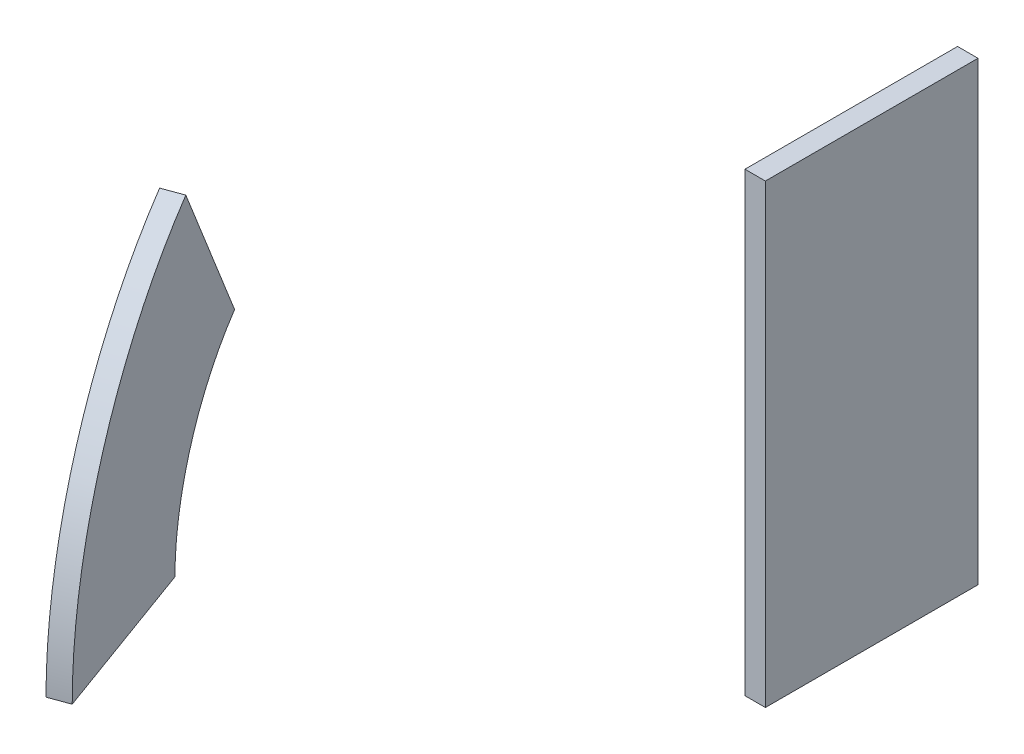
ISO-10303-21;
HEADER;
FILE_DESCRIPTION(('STEP AP214'),'2;1');
FILE_NAME('part.step','',(''),(''),'','','');
FILE_SCHEMA(('AUTOMOTIVE_DESIGN { 1 0 10303 214 1 1 1 1 }'));
ENDSEC;
DATA;
#1=APPLICATION_CONTEXT('core data for automotive mechanical design processes');
#2=APPLICATION_PROTOCOL_DEFINITION('international standard','automotive_design',2000,#1);
#3=PRODUCT_CONTEXT('',#1,'mechanical');
#4=PRODUCT('Part','Part','',(#3));
#5=PRODUCT_RELATED_PRODUCT_CATEGORY('part','',(#4));
#6=PRODUCT_DEFINITION_FORMATION('','',#4);
#7=PRODUCT_DEFINITION_CONTEXT('part definition',#1,'design');
#8=PRODUCT_DEFINITION('design','',#6,#7);
#9=PRODUCT_DEFINITION_SHAPE('','',#8);
#10=(LENGTH_UNIT() NAMED_UNIT(*) SI_UNIT(.MILLI.,.METRE.));
#11=(NAMED_UNIT(*) PLANE_ANGLE_UNIT() SI_UNIT($,.RADIAN.));
#12=(NAMED_UNIT(*) SI_UNIT($,.STERADIAN.) SOLID_ANGLE_UNIT());
#13=UNCERTAINTY_MEASURE_WITH_UNIT(LENGTH_MEASURE(1.E-05),#10,'distance_accuracy_value','');
#14=(GEOMETRIC_REPRESENTATION_CONTEXT(3) GLOBAL_UNCERTAINTY_ASSIGNED_CONTEXT((#13)) GLOBAL_UNIT_ASSIGNED_CONTEXT((#10,
#11,#12)) REPRESENTATION_CONTEXT('',''));
#15=CARTESIAN_POINT('',(0.,0.,0.));
#16=DIRECTION('',(0.,0.,1.));
#17=DIRECTION('',(1.,0.,0.));
#18=AXIS2_PLACEMENT_3D('',#15,#16,#17);
#19=CARTESIAN_POINT('',(236.363341530626,223.05671908958,-132.023261829579));
#20=DIRECTION('',(0.,1.,0.));
#21=DIRECTION('',(0.,0.,1.));
#22=AXIS2_PLACEMENT_3D('',#19,#20,#21);
#23=PLANE('',#22);
#24=DIRECTION('',(1.,0.,0.));
#25=VECTOR('',#24,1.);
#26=CARTESIAN_POINT('',(236.363341530626,223.05671908958,-236.024847646119));
#27=LINE('',#26,#25);
#28=CARTESIAN_POINT('',(226.363341530626,223.05671908958,-236.024847646119));
#29=VERTEX_POINT('',#28);
#30=CARTESIAN_POINT('',(236.363341530626,223.05671908958,-236.024847646119));
#31=VERTEX_POINT('',#30);
#32=EDGE_CURVE('E13',#29,#31,#27,.T.);
#33=ORIENTED_EDGE('',*,*,#32,.F.);
#34=DIRECTION('',(0.,0.,1.));
#35=VECTOR('',#34,1.);
#36=CARTESIAN_POINT('',(226.363341530626,223.05671908958,-184.024054737849));
#37=LINE('',#36,#35);
#38=CARTESIAN_POINT('',(226.363341530626,223.05671908958,-132.023261829579));
#39=VERTEX_POINT('',#38);
#40=EDGE_CURVE('E88',#29,#39,#37,.T.);
#41=ORIENTED_EDGE('',*,*,#40,.T.);
#42=DIRECTION('',(1.,0.,0.));
#43=VECTOR('',#42,1.);
#44=CARTESIAN_POINT('',(236.363341530626,223.05671908958,-132.023261829579));
#45=LINE('',#44,#43);
#46=CARTESIAN_POINT('',(236.363341530626,223.05671908958,-132.023261829579));
#47=VERTEX_POINT('',#46);
#48=EDGE_CURVE('E62',#39,#47,#45,.T.);
#49=ORIENTED_EDGE('',*,*,#48,.T.);
#50=DIRECTION('',(0.,0.,1.));
#51=VECTOR('',#50,1.);
#52=CARTESIAN_POINT('',(236.363341530626,223.05671908958,-132.023261829579));
#53=LINE('',#52,#51);
#54=EDGE_CURVE('E91',#31,#47,#53,.T.);
#55=ORIENTED_EDGE('',*,*,#54,.F.);
#56=EDGE_LOOP('',(#33,#41,#49,#55));
#57=FACE_BOUND('',#56,.T.);
#58=ADVANCED_FACE('F52',(#57),#23,.T.);
#59=CARTESIAN_POINT('',(236.363341530626,0.,-132.023261829579));
#60=DIRECTION('',(0.,0.,1.));
#61=DIRECTION('',(0.,-1.,0.));
#62=AXIS2_PLACEMENT_3D('',#59,#60,#61);
#63=PLANE('',#62);
#64=ORIENTED_EDGE('',*,*,#48,.F.);
#65=DIRECTION('',(0.,1.,0.));
#66=VECTOR('',#65,1.);
#67=CARTESIAN_POINT('',(226.363341530626,111.52835954479,-132.023261829579));
#68=LINE('',#67,#66);
#69=CARTESIAN_POINT('',(226.363341530626,0.,-132.023261829579));
#70=VERTEX_POINT('',#69);
#71=EDGE_CURVE('E103',#39,#70,#68,.F.);
#72=ORIENTED_EDGE('',*,*,#71,.T.);
#73=DIRECTION('',(1.,0.,0.));
#74=VECTOR('',#73,1.);
#75=CARTESIAN_POINT('',(236.363341530626,0.,-132.023261829579));
#76=LINE('',#75,#74);
#77=CARTESIAN_POINT('',(236.363341530626,0.,-132.023261829579));
#78=VERTEX_POINT('',#77);
#79=EDGE_CURVE('E112',#70,#78,#76,.T.);
#80=ORIENTED_EDGE('',*,*,#79,.T.);
#81=DIRECTION('',(0.,-1.,0.));
#82=VECTOR('',#81,1.);
#83=CARTESIAN_POINT('',(236.363341530626,0.,-132.023261829579));
#84=LINE('',#83,#82);
#85=EDGE_CURVE('E107',#47,#78,#84,.T.);
#86=ORIENTED_EDGE('',*,*,#85,.F.);
#87=EDGE_LOOP('',(#64,#72,#80,#86));
#88=FACE_BOUND('',#87,.T.);
#89=ADVANCED_FACE('F120',(#88),#63,.T.);
#90=CARTESIAN_POINT('',(236.363341530626,0.,-236.024847646119));
#91=DIRECTION('',(0.,-1.,0.));
#92=DIRECTION('',(0.,0.,-1.));
#93=AXIS2_PLACEMENT_3D('',#90,#91,#92);
#94=PLANE('',#93);
#95=ORIENTED_EDGE('',*,*,#79,.F.);
#96=DIRECTION('',(0.,0.,1.));
#97=VECTOR('',#96,1.);
#98=CARTESIAN_POINT('',(226.363341530626,0.,-184.024054737849));
#99=LINE('',#98,#97);
#100=CARTESIAN_POINT('',(226.363341530626,0.,-236.024847646119));
#101=VERTEX_POINT('',#100);
#102=EDGE_CURVE('E105',#70,#101,#99,.F.);
#103=ORIENTED_EDGE('',*,*,#102,.T.);
#104=DIRECTION('',(1.,0.,0.));
#105=VECTOR('',#104,1.);
#106=CARTESIAN_POINT('',(236.363341530626,0.,-236.024847646119));
#107=LINE('',#106,#105);
#108=CARTESIAN_POINT('',(236.363341530626,0.,-236.024847646119));
#109=VERTEX_POINT('',#108);
#110=EDGE_CURVE('E56',#101,#109,#107,.T.);
#111=ORIENTED_EDGE('',*,*,#110,.T.);
#112=DIRECTION('',(0.,0.,-1.));
#113=VECTOR('',#112,1.);
#114=CARTESIAN_POINT('',(236.363341530626,0.,-236.024847646119));
#115=LINE('',#114,#113);
#116=EDGE_CURVE('E121',#78,#109,#115,.T.);
#117=ORIENTED_EDGE('',*,*,#116,.F.);
#118=EDGE_LOOP('',(#95,#103,#111,#117));
#119=FACE_BOUND('',#118,.T.);
#120=ADVANCED_FACE('F125',(#119),#94,.T.);
#121=CARTESIAN_POINT('',(236.363341530626,223.05671908958,-236.024847646119));
#122=DIRECTION('',(0.,0.,-1.));
#123=DIRECTION('',(0.,1.,0.));
#124=AXIS2_PLACEMENT_3D('',#121,#122,#123);
#125=PLANE('',#124);
#126=DIRECTION('',(0.,1.,0.));
#127=VECTOR('',#126,1.);
#128=CARTESIAN_POINT('',(226.363341530626,111.52835954479,-236.024847646119));
#129=LINE('',#128,#127);
#130=EDGE_CURVE('E101',#101,#29,#129,.T.);
#131=ORIENTED_EDGE('',*,*,#130,.T.);
#132=ORIENTED_EDGE('',*,*,#32,.T.);
#133=DIRECTION('',(0.,1.,0.));
#134=VECTOR('',#133,1.);
#135=CARTESIAN_POINT('',(236.363341530626,223.05671908958,-236.024847646119));
#136=LINE('',#135,#134);
#137=EDGE_CURVE('E119',#109,#31,#136,.T.);
#138=ORIENTED_EDGE('',*,*,#137,.F.);
#139=ORIENTED_EDGE('',*,*,#110,.F.);
#140=EDGE_LOOP('',(#131,#132,#138,#139));
#141=FACE_BOUND('',#140,.T.);
#142=ADVANCED_FACE('F54',(#141),#125,.T.);
#143=CARTESIAN_POINT('',(236.363341530626,111.52835954479,-184.024054737849));
#144=DIRECTION('',(1.,0.,0.));
#145=DIRECTION('',(0.,1.,0.));
#146=AXIS2_PLACEMENT_3D('',#143,#144,#145);
#147=PLANE('',#146);
#148=ORIENTED_EDGE('',*,*,#116,.T.);
#149=ORIENTED_EDGE('',*,*,#137,.T.);
#150=ORIENTED_EDGE('',*,*,#54,.T.);
#151=ORIENTED_EDGE('',*,*,#85,.T.);
#152=EDGE_LOOP('',(#148,#149,#150,#151));
#153=FACE_BOUND('',#152,.T.);
#154=ADVANCED_FACE('F118',(#153),#147,.T.);
#155=CARTESIAN_POINT('',(226.363341530626,111.52835954479,-184.024054737849));
#156=DIRECTION('',(1.,0.,0.));
#157=DIRECTION('',(0.,1.,0.));
#158=AXIS2_PLACEMENT_3D('',#155,#156,#157);
#159=PLANE('',#158);
#160=ORIENTED_EDGE('',*,*,#102,.F.);
#161=ORIENTED_EDGE('',*,*,#71,.F.);
#162=ORIENTED_EDGE('',*,*,#40,.F.);
#163=ORIENTED_EDGE('',*,*,#130,.F.);
#164=EDGE_LOOP('',(#160,#161,#162,#163));
#165=FACE_BOUND('',#164,.T.);
#166=ADVANCED_FACE('F100',(#165),#159,.F.);
#167=CLOSED_SHELL('',(#58,#89,#120,#142,#154,#166));
#168=MANIFOLD_SOLID_BREP('B2',#167);
#169=CARTESIAN_POINT('',(33.5231532977672,156.000868021922,-51.349566614581));
#170=DIRECTION('',(-0.301461634679263,0.474776972334248,-0.826866197977418));
#171=DIRECTION('',(0.16262475042835,0.880106145042247,0.44605645831777));
#172=AXIS2_PLACEMENT_3D('',#169,#170,#171);
#173=PLANE('',#172);
#174=DIRECTION('',(0.939507356737892,0.,-0.34252872381069));
#175=VECTOR('',#174,1.);
#176=CARTESIAN_POINT('',(19.8343783303096,81.918817563878,-88.8959208110367));
#177=LINE('',#176,#175);
#178=CARTESIAN_POINT('',(10.4393047629307,81.918817563878,-85.4706335729298));
#179=VERTEX_POINT('',#178);
#180=CARTESIAN_POINT('',(19.8343783303096,81.918817563878,-88.8959208110367));
#181=VERTEX_POINT('',#180);
#182=EDGE_CURVE('E50',#179,#181,#177,.T.);
#183=ORIENTED_EDGE('',*,*,#182,.F.);
#184=DIRECTION('',(0.16262475042835,0.880106145042247,0.44605645831777));
#185=VECTOR('',#184,1.);
#186=CARTESIAN_POINT('',(24.1280797303882,156.000868021922,-47.9242793764741));
#187=LINE('',#186,#185);
#188=CARTESIAN_POINT('',(24.1280797303882,156.000868021922,-47.9242793764741));
#189=VERTEX_POINT('',#188);
#190=EDGE_CURVE('E224',#179,#189,#187,.T.);
#191=ORIENTED_EDGE('',*,*,#190,.T.);
#192=DIRECTION('',(0.939507356737892,0.,-0.34252872381069));
#193=VECTOR('',#192,1.);
#194=CARTESIAN_POINT('',(33.5231532977672,156.000868021922,-51.349566614581));
#195=LINE('',#194,#193);
#196=CARTESIAN_POINT('',(33.5231532977672,156.000868021922,-51.349566614581));
#197=VERTEX_POINT('',#196);
#198=EDGE_CURVE('E198',#189,#197,#195,.T.);
#199=ORIENTED_EDGE('',*,*,#198,.T.);
#200=DIRECTION('',(0.16262475042835,0.880106145042247,0.44605645831777));
#201=VECTOR('',#200,1.);
#202=CARTESIAN_POINT('',(33.5231532977672,156.000868021922,-51.349566614581));
#203=LINE('',#202,#201);
#204=EDGE_CURVE('E227',#181,#197,#203,.T.);
#205=ORIENTED_EDGE('',*,*,#204,.F.);
#206=EDGE_LOOP('',(#183,#191,#199,#205));
#207=FACE_BOUND('',#206,.T.);
#208=ADVANCED_FACE('F188',(#207),#173,.T.);
#209=CARTESIAN_POINT('',(4.69753678368945,0.,-130.414114767481));
#210=DIRECTION('',(0.939507356737892,0.,-0.34252872381069));
#211=DIRECTION('',(-0.34252872381069,0.,-0.939507356737892));
#212=AXIS2_PLACEMENT_3D('',#209,#210,#211);
#213=CYLINDRICAL_SURFACE('',#212,177.252333597141);
#214=ORIENTED_EDGE('',*,*,#198,.F.);
#215=CARTESIAN_POINT('',(-4.69753678368947,0.,-126.988827529375));
#216=DIRECTION('',(0.939507356737892,0.,-0.342528723810689));
#217=DIRECTION('',(-0.34252872381069,0.,-0.939507356737892));
#218=AXIS2_PLACEMENT_3D('',#215,#216,#217);
#219=CIRCLE('',#218,177.252333597141);
#220=CARTESIAN_POINT('',(56.0164788358058,-4.3891708625124E-13,39.5410438840982));
#221=VERTEX_POINT('',#220);
#222=EDGE_CURVE('E239',#189,#221,#219,.T.);
#223=ORIENTED_EDGE('',*,*,#222,.T.);
#224=DIRECTION('',(0.939507356737892,0.,-0.34252872381069));
#225=VECTOR('',#224,1.);
#226=CARTESIAN_POINT('',(65.4115524031847,-5.05673099003568E-13,36.1157566459913));
#227=LINE('',#226,#225);
#228=CARTESIAN_POINT('',(65.4115524031847,-5.05673099003568E-13,36.1157566459913));
#229=VERTEX_POINT('',#228);
#230=EDGE_CURVE('E248',#221,#229,#227,.T.);
#231=ORIENTED_EDGE('',*,*,#230,.T.);
#232=CARTESIAN_POINT('',(4.69753678368945,0.,-130.414114767481));
#233=DIRECTION('',(0.939507356737892,0.,-0.342528723810689));
#234=DIRECTION('',(0.34252872381069,0.,0.939507356737892));
#235=AXIS2_PLACEMENT_3D('',#232,#233,#234);
#236=CIRCLE('',#235,177.252333597141);
#237=EDGE_CURVE('E243',#197,#229,#236,.T.);
#238=ORIENTED_EDGE('',*,*,#237,.F.);
#239=EDGE_LOOP('',(#214,#223,#231,#238));
#240=FACE_BOUND('',#239,.T.);
#241=ADVANCED_FACE('F256',(#240),#213,.T.);
#242=CARTESIAN_POINT('',(36.5795412376964,-2.59913273038822E-13,-42.9663311222052));
#243=DIRECTION('',(0.,-1.,0.));
#244=DIRECTION('',(-0.34252872381069,0.,-0.939507356737892));
#245=AXIS2_PLACEMENT_3D('',#242,#243,#244);
#246=PLANE('',#245);
#247=ORIENTED_EDGE('',*,*,#230,.F.);
#248=DIRECTION('',(-0.34252872381069,0.,-0.939507356737892));
#249=VECTOR('',#248,1.);
#250=CARTESIAN_POINT('',(-9.39507356737895,-4.3891708625124E-13,-139.873499850351));
#251=LINE('',#250,#249);
#252=CARTESIAN_POINT('',(27.1844676703175,-4.3891708625124E-13,-39.5410438840982));
#253=VERTEX_POINT('',#252);
#254=EDGE_CURVE('E241',#221,#253,#251,.T.);
#255=ORIENTED_EDGE('',*,*,#254,.T.);
#256=DIRECTION('',(0.939507356737892,0.,-0.34252872381069));
#257=VECTOR('',#256,1.);
#258=CARTESIAN_POINT('',(36.5795412376964,-2.59913273038822E-13,-42.9663311222052));
#259=LINE('',#258,#257);
#260=CARTESIAN_POINT('',(36.5795412376964,-2.59913273038822E-13,-42.9663311222052));
#261=VERTEX_POINT('',#260);
#262=EDGE_CURVE('E192',#253,#261,#259,.T.);
#263=ORIENTED_EDGE('',*,*,#262,.T.);
#264=DIRECTION('',(-0.34252872381069,0.,-0.939507356737892));
#265=VECTOR('',#264,1.);
#266=CARTESIAN_POINT('',(36.5795412376964,-2.59913273038822E-13,-42.9663311222052));
#267=LINE('',#266,#265);
#268=EDGE_CURVE('E257',#229,#261,#267,.T.);
#269=ORIENTED_EDGE('',*,*,#268,.F.);
#270=EDGE_LOOP('',(#247,#255,#263,#269));
#271=FACE_BOUND('',#270,.T.);
#272=ADVANCED_FACE('F261',(#271),#246,.T.);
#273=CARTESIAN_POINT('',(4.69753678368945,0.,-130.414114767481));
#274=DIRECTION('',(0.939507356737892,0.,-0.34252872381069));
#275=DIRECTION('',(-0.34252872381069,0.,-0.939507356737892));
#276=AXIS2_PLACEMENT_3D('',#273,#274,#275);
#277=CYLINDRICAL_SURFACE('',#276,93.0783383633183);
#278=CARTESIAN_POINT('',(-4.69753678368947,0.,-126.988827529375));
#279=DIRECTION('',(-0.939507356737892,0.,0.342528723810689));
#280=DIRECTION('',(0.342528723810689,0.,0.939507356737892));
#281=AXIS2_PLACEMENT_3D('',#278,#279,#280);
#282=CIRCLE('',#281,93.0783383633183);
#283=EDGE_CURVE('E237',#253,#179,#282,.T.);
#284=ORIENTED_EDGE('',*,*,#283,.T.);
#285=ORIENTED_EDGE('',*,*,#182,.T.);
#286=CARTESIAN_POINT('',(4.69753678368945,0.,-130.414114767481));
#287=DIRECTION('',(-0.939507356737892,0.,0.342528723810689));
#288=DIRECTION('',(-0.342528723810689,0.,-0.939507356737892));
#289=AXIS2_PLACEMENT_3D('',#286,#287,#288);
#290=CIRCLE('',#289,93.0783383633183);
#291=EDGE_CURVE('E255',#261,#181,#290,.T.);
#292=ORIENTED_EDGE('',*,*,#291,.F.);
#293=ORIENTED_EDGE('',*,*,#262,.F.);
#294=EDGE_LOOP('',(#284,#285,#292,#293));
#295=FACE_BOUND('',#294,.T.);
#296=ADVANCED_FACE('F190',(#295),#277,.F.);
#297=CARTESIAN_POINT('',(0.,0.,-143.298787088458));
#298=DIRECTION('',(0.939507356737892,0.,-0.34252872381069));
#299=DIRECTION('',(-0.34252872381069,0.,-0.939507356737892));
#300=AXIS2_PLACEMENT_3D('',#297,#298,#299);
#301=PLANE('',#300);
#302=ORIENTED_EDGE('',*,*,#268,.T.);
#303=ORIENTED_EDGE('',*,*,#291,.T.);
#304=ORIENTED_EDGE('',*,*,#204,.T.);
#305=ORIENTED_EDGE('',*,*,#237,.T.);
#306=EDGE_LOOP('',(#302,#303,#304,#305));
#307=FACE_BOUND('',#306,.T.);
#308=ADVANCED_FACE('F254',(#307),#301,.T.);
#309=CARTESIAN_POINT('',(-9.39507356737895,0.,-139.873499850351));
#310=DIRECTION('',(0.939507356737892,0.,-0.34252872381069));
#311=DIRECTION('',(-0.34252872381069,0.,-0.939507356737892));
#312=AXIS2_PLACEMENT_3D('',#309,#310,#311);
#313=PLANE('',#312);
#314=ORIENTED_EDGE('',*,*,#254,.F.);
#315=ORIENTED_EDGE('',*,*,#222,.F.);
#316=ORIENTED_EDGE('',*,*,#190,.F.);
#317=ORIENTED_EDGE('',*,*,#283,.F.);
#318=EDGE_LOOP('',(#314,#315,#316,#317));
#319=FACE_BOUND('',#318,.T.);
#320=ADVANCED_FACE('F236',(#319),#313,.F.);
#321=CLOSED_SHELL('',(#208,#241,#272,#296,#308,#320));
#322=MANIFOLD_SOLID_BREP('B7',#321);
#323=ADVANCED_BREP_SHAPE_REPRESENTATION('',(#18,#168,#322),#14);
#324=SHAPE_DEFINITION_REPRESENTATION(#9,#323);
ENDSEC;
END-ISO-10303-21;
